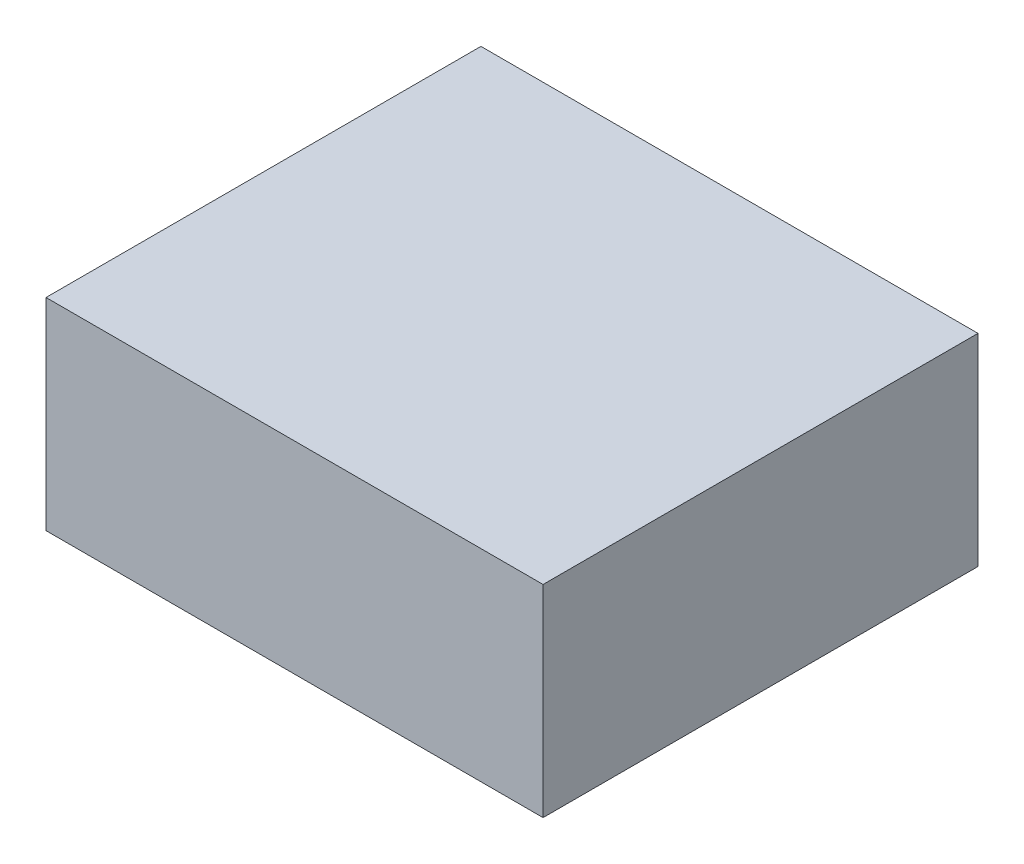
ISO-10303-21;
HEADER;
FILE_DESCRIPTION(('STEP AP214'),'2;1');
FILE_NAME('part.step','',(''),(''),'','','');
FILE_SCHEMA(('AUTOMOTIVE_DESIGN { 1 0 10303 214 1 1 1 1 }'));
ENDSEC;
DATA;
#1=APPLICATION_CONTEXT('core data for automotive mechanical design processes');
#2=APPLICATION_PROTOCOL_DEFINITION('international standard','automotive_design',2000,#1);
#3=PRODUCT_CONTEXT('',#1,'mechanical');
#4=PRODUCT('Part','Part','',(#3));
#5=PRODUCT_RELATED_PRODUCT_CATEGORY('part','',(#4));
#6=PRODUCT_DEFINITION_FORMATION('','',#4);
#7=PRODUCT_DEFINITION_CONTEXT('part definition',#1,'design');
#8=PRODUCT_DEFINITION('design','',#6,#7);
#9=PRODUCT_DEFINITION_SHAPE('','',#8);
#10=(LENGTH_UNIT() NAMED_UNIT(*) SI_UNIT(.MILLI.,.METRE.));
#11=(NAMED_UNIT(*) PLANE_ANGLE_UNIT() SI_UNIT($,.RADIAN.));
#12=(NAMED_UNIT(*) SI_UNIT($,.STERADIAN.) SOLID_ANGLE_UNIT());
#13=UNCERTAINTY_MEASURE_WITH_UNIT(LENGTH_MEASURE(1.E-05),#10,'distance_accuracy_value','');
#14=(GEOMETRIC_REPRESENTATION_CONTEXT(3) GLOBAL_UNCERTAINTY_ASSIGNED_CONTEXT((#13)) GLOBAL_UNIT_ASSIGNED_CONTEXT((#10,
#11,#12)) REPRESENTATION_CONTEXT('',''));
#15=CARTESIAN_POINT('',(0.,0.,0.));
#16=DIRECTION('',(0.,0.,1.));
#17=DIRECTION('',(1.,0.,0.));
#18=AXIS2_PLACEMENT_3D('',#15,#16,#17);
#19=CARTESIAN_POINT('',(80.00000002,-32.500000024,69.999999954));
#20=DIRECTION('',(-1.,0.,0.));
#21=DIRECTION('',(0.,0.,1.));
#22=AXIS2_PLACEMENT_3D('',#19,#20,#21);
#23=PLANE('',#22);
#24=DIRECTION('',(0.,1.,0.));
#25=VECTOR('',#24,1.);
#26=CARTESIAN_POINT('',(80.00000002,-32.500000024,-69.999999954));
#27=LINE('',#26,#25);
#28=CARTESIAN_POINT('',(80.00000002,-32.500000024,-69.999999954));
#29=VERTEX_POINT('',#28);
#30=CARTESIAN_POINT('',(80.00000002,32.500000024,-69.999999954));
#31=VERTEX_POINT('',#30);
#32=EDGE_CURVE('E98',#29,#31,#27,.T.);
#33=ORIENTED_EDGE('',*,*,#32,.T.);
#34=DIRECTION('',(0.,0.,-1.));
#35=VECTOR('',#34,1.);
#36=CARTESIAN_POINT('',(80.00000002,32.500000024,69.999999954));
#37=LINE('',#36,#35);
#38=CARTESIAN_POINT('',(80.00000002,32.500000024,69.999999954));
#39=VERTEX_POINT('',#38);
#40=EDGE_CURVE('E11',#39,#31,#37,.T.);
#41=ORIENTED_EDGE('',*,*,#40,.F.);
#42=DIRECTION('',(0.,1.,0.));
#43=VECTOR('',#42,1.);
#44=CARTESIAN_POINT('',(80.00000002,-32.500000024,69.999999954));
#45=LINE('',#44,#43);
#46=CARTESIAN_POINT('',(80.00000002,-32.500000024,69.999999954));
#47=VERTEX_POINT('',#46);
#48=EDGE_CURVE('E86',#47,#39,#45,.T.);
#49=ORIENTED_EDGE('',*,*,#48,.F.);
#50=DIRECTION('',(0.,0.,-1.));
#51=VECTOR('',#50,1.);
#52=CARTESIAN_POINT('',(80.00000002,-32.500000024,69.999999954));
#53=LINE('',#52,#51);
#54=EDGE_CURVE('E94',#47,#29,#53,.T.);
#55=ORIENTED_EDGE('',*,*,#54,.T.);
#56=EDGE_LOOP('',(#33,#41,#49,#55));
#57=FACE_BOUND('',#56,.T.);
#58=ADVANCED_FACE('F35',(#57),#23,.F.);
#59=CARTESIAN_POINT('',(-80.00000002,32.500000024,69.999999954));
#60=DIRECTION('',(0.,-1.,0.));
#61=DIRECTION('',(0.,0.,-1.));
#62=AXIS2_PLACEMENT_3D('',#59,#60,#61);
#63=PLANE('',#62);
#64=DIRECTION('',(-1.,0.,0.));
#65=VECTOR('',#64,1.);
#66=CARTESIAN_POINT('',(-80.00000002,32.500000024,-69.999999954));
#67=LINE('',#66,#65);
#68=CARTESIAN_POINT('',(-80.00000002,32.500000024,-69.999999954));
#69=VERTEX_POINT('',#68);
#70=EDGE_CURVE('E90',#31,#69,#67,.T.);
#71=ORIENTED_EDGE('',*,*,#70,.T.);
#72=DIRECTION('',(0.,0.,-1.));
#73=VECTOR('',#72,1.);
#74=CARTESIAN_POINT('',(-80.00000002,32.500000024,69.999999954));
#75=LINE('',#74,#73);
#76=CARTESIAN_POINT('',(-80.00000002,32.500000024,69.999999954));
#77=VERTEX_POINT('',#76);
#78=EDGE_CURVE('E43',#77,#69,#75,.T.);
#79=ORIENTED_EDGE('',*,*,#78,.F.);
#80=DIRECTION('',(-1.,0.,0.));
#81=VECTOR('',#80,1.);
#82=CARTESIAN_POINT('',(-80.00000002,32.500000024,69.999999954));
#83=LINE('',#82,#81);
#84=EDGE_CURVE('E81',#39,#77,#83,.T.);
#85=ORIENTED_EDGE('',*,*,#84,.F.);
#86=ORIENTED_EDGE('',*,*,#40,.T.);
#87=EDGE_LOOP('',(#71,#79,#85,#86));
#88=FACE_BOUND('',#87,.T.);
#89=ADVANCED_FACE('F89',(#88),#63,.F.);
#90=CARTESIAN_POINT('',(-80.00000002,-32.500000024,69.999999954));
#91=DIRECTION('',(1.,0.,0.));
#92=DIRECTION('',(0.,0.,-1.));
#93=AXIS2_PLACEMENT_3D('',#90,#91,#92);
#94=PLANE('',#93);
#95=DIRECTION('',(0.,-1.,0.));
#96=VECTOR('',#95,1.);
#97=CARTESIAN_POINT('',(-80.00000002,-32.500000024,-69.999999954));
#98=LINE('',#97,#96);
#99=CARTESIAN_POINT('',(-80.00000002,-32.500000024,-69.999999954));
#100=VERTEX_POINT('',#99);
#101=EDGE_CURVE('E68',#69,#100,#98,.T.);
#102=ORIENTED_EDGE('',*,*,#101,.T.);
#103=DIRECTION('',(0.,0.,-1.));
#104=VECTOR('',#103,1.);
#105=CARTESIAN_POINT('',(-80.00000002,-32.500000024,69.999999954));
#106=LINE('',#105,#104);
#107=CARTESIAN_POINT('',(-80.00000002,-32.500000024,69.999999954));
#108=VERTEX_POINT('',#107);
#109=EDGE_CURVE('E91',#108,#100,#106,.T.);
#110=ORIENTED_EDGE('',*,*,#109,.F.);
#111=DIRECTION('',(0.,-1.,0.));
#112=VECTOR('',#111,1.);
#113=CARTESIAN_POINT('',(-80.00000002,-32.500000024,69.999999954));
#114=LINE('',#113,#112);
#115=EDGE_CURVE('E84',#77,#108,#114,.T.);
#116=ORIENTED_EDGE('',*,*,#115,.F.);
#117=ORIENTED_EDGE('',*,*,#78,.T.);
#118=EDGE_LOOP('',(#102,#110,#116,#117));
#119=FACE_BOUND('',#118,.T.);
#120=ADVANCED_FACE('F92',(#119),#94,.F.);
#121=CARTESIAN_POINT('',(-80.00000002,-32.500000024,69.999999954));
#122=DIRECTION('',(0.,1.,0.));
#123=DIRECTION('',(0.,0.,1.));
#124=AXIS2_PLACEMENT_3D('',#121,#122,#123);
#125=PLANE('',#124);
#126=DIRECTION('',(1.,0.,0.));
#127=VECTOR('',#126,1.);
#128=CARTESIAN_POINT('',(-80.00000002,-32.500000024,-69.999999954));
#129=LINE('',#128,#127);
#130=EDGE_CURVE('E74',#100,#29,#129,.T.);
#131=ORIENTED_EDGE('',*,*,#130,.T.);
#132=ORIENTED_EDGE('',*,*,#54,.F.);
#133=DIRECTION('',(1.,0.,0.));
#134=VECTOR('',#133,1.);
#135=CARTESIAN_POINT('',(-80.00000002,-32.500000024,69.999999954));
#136=LINE('',#135,#134);
#137=EDGE_CURVE('E51',#108,#47,#136,.T.);
#138=ORIENTED_EDGE('',*,*,#137,.F.);
#139=ORIENTED_EDGE('',*,*,#109,.T.);
#140=EDGE_LOOP('',(#131,#132,#138,#139));
#141=FACE_BOUND('',#140,.T.);
#142=ADVANCED_FACE('F105',(#141),#125,.F.);
#143=CARTESIAN_POINT('',(0.,0.,69.999999954));
#144=DIRECTION('',(0.,0.,-1.));
#145=DIRECTION('',(-1.,0.,0.));
#146=AXIS2_PLACEMENT_3D('',#143,#144,#145);
#147=PLANE('',#146);
#148=ORIENTED_EDGE('',*,*,#48,.T.);
#149=ORIENTED_EDGE('',*,*,#84,.T.);
#150=ORIENTED_EDGE('',*,*,#115,.T.);
#151=ORIENTED_EDGE('',*,*,#137,.T.);
#152=EDGE_LOOP('',(#148,#149,#150,#151));
#153=FACE_BOUND('',#152,.T.);
#154=ADVANCED_FACE('F82',(#153),#147,.F.);
#155=CARTESIAN_POINT('',(0.,0.,-69.999999954));
#156=DIRECTION('',(0.,0.,-1.));
#157=DIRECTION('',(-1.,0.,0.));
#158=AXIS2_PLACEMENT_3D('',#155,#156,#157);
#159=PLANE('',#158);
#160=ORIENTED_EDGE('',*,*,#32,.F.);
#161=ORIENTED_EDGE('',*,*,#130,.F.);
#162=ORIENTED_EDGE('',*,*,#101,.F.);
#163=ORIENTED_EDGE('',*,*,#70,.F.);
#164=EDGE_LOOP('',(#160,#161,#162,#163));
#165=FACE_BOUND('',#164,.T.);
#166=ADVANCED_FACE('F108',(#165),#159,.T.);
#167=CLOSED_SHELL('',(#58,#89,#120,#142,#154,#166));
#168=MANIFOLD_SOLID_BREP('B2',#167);
#169=ADVANCED_BREP_SHAPE_REPRESENTATION('',(#18,#168),#14);
#170=SHAPE_DEFINITION_REPRESENTATION(#9,#169);
ENDSEC;
END-ISO-10303-21;
